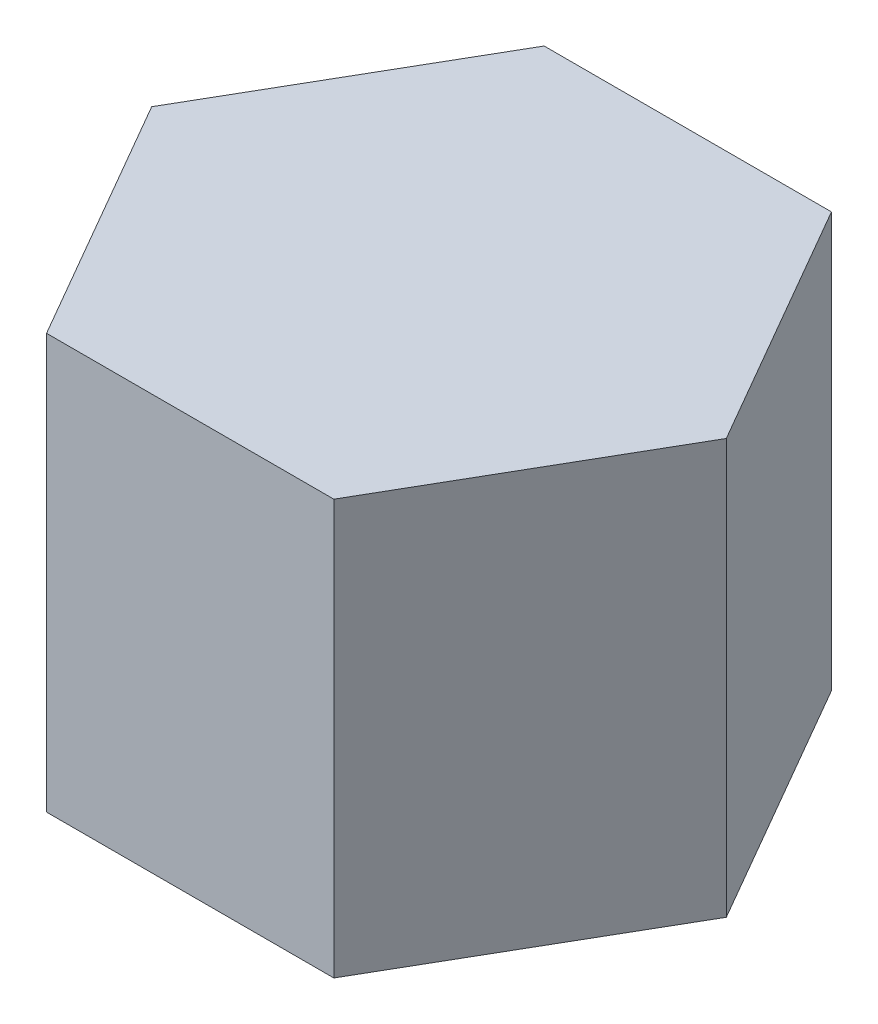
ISO-10303-21;
HEADER;
FILE_DESCRIPTION(('STEP AP214'),'2;1');
FILE_NAME('part.step','',(''),(''),'','','');
FILE_SCHEMA(('AUTOMOTIVE_DESIGN { 1 0 10303 214 1 1 1 1 }'));
ENDSEC;
DATA;
#1=APPLICATION_CONTEXT('core data for automotive mechanical design processes');
#2=APPLICATION_PROTOCOL_DEFINITION('international standard','automotive_design',2000,#1);
#3=PRODUCT_CONTEXT('',#1,'mechanical');
#4=PRODUCT('Part','Part','',(#3));
#5=PRODUCT_RELATED_PRODUCT_CATEGORY('part','',(#4));
#6=PRODUCT_DEFINITION_FORMATION('','',#4);
#7=PRODUCT_DEFINITION_CONTEXT('part definition',#1,'design');
#8=PRODUCT_DEFINITION('design','',#6,#7);
#9=PRODUCT_DEFINITION_SHAPE('','',#8);
#10=(LENGTH_UNIT() NAMED_UNIT(*) SI_UNIT(.MILLI.,.METRE.));
#11=(NAMED_UNIT(*) PLANE_ANGLE_UNIT() SI_UNIT($,.RADIAN.));
#12=(NAMED_UNIT(*) SI_UNIT($,.STERADIAN.) SOLID_ANGLE_UNIT());
#13=UNCERTAINTY_MEASURE_WITH_UNIT(LENGTH_MEASURE(1.E-05),#10,'distance_accuracy_value','');
#14=(GEOMETRIC_REPRESENTATION_CONTEXT(3) GLOBAL_UNCERTAINTY_ASSIGNED_CONTEXT((#13)) GLOBAL_UNIT_ASSIGNED_CONTEXT((#10,
#11,#12)) REPRESENTATION_CONTEXT('',''));
#15=CARTESIAN_POINT('',(0.,0.,0.));
#16=DIRECTION('',(0.,0.,1.));
#17=DIRECTION('',(1.,0.,0.));
#18=AXIS2_PLACEMENT_3D('',#15,#16,#17);
#19=CARTESIAN_POINT('',(32.3205080756887,25.,14.9999999999998));
#20=DIRECTION('',(-0.866025403784435,0.,0.500000000000007));
#21=DIRECTION('',(0.500000000000007,0.,0.866025403784435));
#22=AXIS2_PLACEMENT_3D('',#19,#20,#21);
#23=PLANE('',#22);
#24=DIRECTION('',(-0.500000000000007,0.,-0.866025403784435));
#25=VECTOR('',#24,1.);
#26=CARTESIAN_POINT('',(32.3205080756887,0.,14.9999999999998));
#27=LINE('',#26,#25);
#28=CARTESIAN_POINT('',(32.3205080756887,0.,14.9999999999998));
#29=VERTEX_POINT('',#28);
#30=CARTESIAN_POINT('',(23.6602540378443,0.,0.));
#31=VERTEX_POINT('',#30);
#32=EDGE_CURVE('E128',#29,#31,#27,.T.);
#33=ORIENTED_EDGE('',*,*,#32,.T.);
#34=DIRECTION('',(0.,-1.,0.));
#35=VECTOR('',#34,1.);
#36=CARTESIAN_POINT('',(23.6602540378443,25.,0.));
#37=LINE('',#36,#35);
#38=CARTESIAN_POINT('',(23.6602540378443,25.,0.));
#39=VERTEX_POINT('',#38);
#40=EDGE_CURVE('E11',#39,#31,#37,.T.);
#41=ORIENTED_EDGE('',*,*,#40,.F.);
#42=DIRECTION('',(-0.500000000000007,0.,-0.866025403784435));
#43=VECTOR('',#42,1.);
#44=CARTESIAN_POINT('',(32.3205080756887,25.,14.9999999999998));
#45=LINE('',#44,#43);
#46=CARTESIAN_POINT('',(32.3205080756887,25.,14.9999999999998));
#47=VERTEX_POINT('',#46);
#48=EDGE_CURVE('E144',#47,#39,#45,.T.);
#49=ORIENTED_EDGE('',*,*,#48,.F.);
#50=DIRECTION('',(0.,-1.,0.));
#51=VECTOR('',#50,1.);
#52=CARTESIAN_POINT('',(32.3205080756887,25.,14.9999999999998));
#53=LINE('',#52,#51);
#54=EDGE_CURVE('E124',#47,#29,#53,.T.);
#55=ORIENTED_EDGE('',*,*,#54,.T.);
#56=EDGE_LOOP('',(#33,#41,#49,#55));
#57=FACE_BOUND('',#56,.T.);
#58=ADVANCED_FACE('F39',(#57),#23,.F.);
#59=CARTESIAN_POINT('',(23.6602540378443,25.,0.));
#60=DIRECTION('',(0.,0.,1.));
#61=DIRECTION('',(1.,0.,0.));
#62=AXIS2_PLACEMENT_3D('',#59,#60,#61);
#63=PLANE('',#62);
#64=DIRECTION('',(-1.,0.,0.));
#65=VECTOR('',#64,1.);
#66=CARTESIAN_POINT('',(23.6602540378443,0.,0.));
#67=LINE('',#66,#65);
#68=CARTESIAN_POINT('',(6.33974596215555,0.,0.));
#69=VERTEX_POINT('',#68);
#70=EDGE_CURVE('E132',#31,#69,#67,.T.);
#71=ORIENTED_EDGE('',*,*,#70,.T.);
#72=DIRECTION('',(0.,-1.,0.));
#73=VECTOR('',#72,1.);
#74=CARTESIAN_POINT('',(6.33974596215555,25.,0.));
#75=LINE('',#74,#73);
#76=CARTESIAN_POINT('',(6.33974596215555,25.,0.));
#77=VERTEX_POINT('',#76);
#78=EDGE_CURVE('E48',#77,#69,#75,.T.);
#79=ORIENTED_EDGE('',*,*,#78,.F.);
#80=DIRECTION('',(-1.,0.,0.));
#81=VECTOR('',#80,1.);
#82=CARTESIAN_POINT('',(23.6602540378443,25.,0.));
#83=LINE('',#82,#81);
#84=EDGE_CURVE('E93',#39,#77,#83,.T.);
#85=ORIENTED_EDGE('',*,*,#84,.F.);
#86=ORIENTED_EDGE('',*,*,#40,.T.);
#87=EDGE_LOOP('',(#71,#79,#85,#86));
#88=FACE_BOUND('',#87,.T.);
#89=ADVANCED_FACE('F172',(#88),#63,.F.);
#90=CARTESIAN_POINT('',(6.33974596215555,25.,0.));
#91=DIRECTION('',(0.866025403784442,0.,0.499999999999995));
#92=DIRECTION('',(0.499999999999995,0.,-0.866025403784442));
#93=AXIS2_PLACEMENT_3D('',#90,#91,#92);
#94=PLANE('',#93);
#95=DIRECTION('',(-0.499999999999995,0.,0.866025403784441));
#96=VECTOR('',#95,1.);
#97=CARTESIAN_POINT('',(6.33974596215555,0.,0.));
#98=LINE('',#97,#96);
#99=CARTESIAN_POINT('',(-2.32050807568875,0.,15.0000000000001));
#100=VERTEX_POINT('',#99);
#101=EDGE_CURVE('E135',#69,#100,#98,.T.);
#102=ORIENTED_EDGE('',*,*,#101,.T.);
#103=DIRECTION('',(0.,-1.,0.));
#104=VECTOR('',#103,1.);
#105=CARTESIAN_POINT('',(-2.32050807568875,25.,15.0000000000001));
#106=LINE('',#105,#104);
#107=CARTESIAN_POINT('',(-2.32050807568875,25.,15.0000000000001));
#108=VERTEX_POINT('',#107);
#109=EDGE_CURVE('E117',#108,#100,#106,.T.);
#110=ORIENTED_EDGE('',*,*,#109,.F.);
#111=DIRECTION('',(-0.499999999999995,0.,0.866025403784441));
#112=VECTOR('',#111,1.);
#113=CARTESIAN_POINT('',(6.33974596215555,25.,0.));
#114=LINE('',#113,#112);
#115=EDGE_CURVE('E106',#77,#108,#114,.T.);
#116=ORIENTED_EDGE('',*,*,#115,.F.);
#117=ORIENTED_EDGE('',*,*,#78,.T.);
#118=EDGE_LOOP('',(#102,#110,#116,#117));
#119=FACE_BOUND('',#118,.T.);
#120=ADVANCED_FACE('F154',(#119),#94,.F.);
#121=CARTESIAN_POINT('',(-2.32050807568875,25.,15.0000000000001));
#122=DIRECTION('',(0.866025403784435,0.,-0.500000000000007));
#123=DIRECTION('',(-0.500000000000007,0.,-0.866025403784435));
#124=AXIS2_PLACEMENT_3D('',#121,#122,#123);
#125=PLANE('',#124);
#126=DIRECTION('',(0.500000000000007,0.,0.866025403784435));
#127=VECTOR('',#126,1.);
#128=CARTESIAN_POINT('',(-2.32050807568875,0.,15.0000000000001));
#129=LINE('',#128,#127);
#130=CARTESIAN_POINT('',(6.33974596215577,0.,30.0000000000001));
#131=VERTEX_POINT('',#130);
#132=EDGE_CURVE('E115',#100,#131,#129,.T.);
#133=ORIENTED_EDGE('',*,*,#132,.T.);
#134=DIRECTION('',(0.,-1.,0.));
#135=VECTOR('',#134,1.);
#136=CARTESIAN_POINT('',(6.33974596215577,25.,30.0000000000001));
#137=LINE('',#136,#135);
#138=CARTESIAN_POINT('',(6.33974596215577,25.,30.0000000000001));
#139=VERTEX_POINT('',#138);
#140=EDGE_CURVE('E112',#139,#131,#137,.T.);
#141=ORIENTED_EDGE('',*,*,#140,.F.);
#142=DIRECTION('',(0.500000000000007,0.,0.866025403784435));
#143=VECTOR('',#142,1.);
#144=CARTESIAN_POINT('',(-2.32050807568875,25.,15.0000000000001));
#145=LINE('',#144,#143);
#146=EDGE_CURVE('E100',#108,#139,#145,.T.);
#147=ORIENTED_EDGE('',*,*,#146,.F.);
#148=ORIENTED_EDGE('',*,*,#109,.T.);
#149=EDGE_LOOP('',(#133,#141,#147,#148));
#150=FACE_BOUND('',#149,.T.);
#151=ADVANCED_FACE('F113',(#150),#125,.F.);
#152=CARTESIAN_POINT('',(6.33974596215577,25.,30.0000000000001));
#153=DIRECTION('',(0.,0.,-1.));
#154=DIRECTION('',(-1.,0.,0.));
#155=AXIS2_PLACEMENT_3D('',#152,#153,#154);
#156=PLANE('',#155);
#157=DIRECTION('',(1.,0.,0.));
#158=VECTOR('',#157,1.);
#159=CARTESIAN_POINT('',(6.33974596215577,0.,30.0000000000001));
#160=LINE('',#159,#158);
#161=CARTESIAN_POINT('',(23.6602540378445,0.,29.9999999999999));
#162=VERTEX_POINT('',#161);
#163=EDGE_CURVE('E79',#131,#162,#160,.T.);
#164=ORIENTED_EDGE('',*,*,#163,.T.);
#165=DIRECTION('',(0.,-1.,0.));
#166=VECTOR('',#165,1.);
#167=CARTESIAN_POINT('',(23.6602540378445,25.,29.9999999999999));
#168=LINE('',#167,#166);
#169=CARTESIAN_POINT('',(23.6602540378445,25.,29.9999999999999));
#170=VERTEX_POINT('',#169);
#171=EDGE_CURVE('E118',#170,#162,#168,.T.);
#172=ORIENTED_EDGE('',*,*,#171,.F.);
#173=DIRECTION('',(1.,0.,0.));
#174=VECTOR('',#173,1.);
#175=CARTESIAN_POINT('',(6.33974596215577,25.,30.0000000000001));
#176=LINE('',#175,#174);
#177=EDGE_CURVE('E104',#139,#170,#176,.T.);
#178=ORIENTED_EDGE('',*,*,#177,.F.);
#179=ORIENTED_EDGE('',*,*,#140,.T.);
#180=EDGE_LOOP('',(#164,#172,#178,#179));
#181=FACE_BOUND('',#180,.T.);
#182=ADVANCED_FACE('F120',(#181),#156,.F.);
#183=CARTESIAN_POINT('',(23.6602540378445,25.,29.9999999999999));
#184=DIRECTION('',(-0.866025403784445,0.,-0.499999999999989));
#185=DIRECTION('',(-0.499999999999989,0.,0.866025403784445));
#186=AXIS2_PLACEMENT_3D('',#183,#184,#185);
#187=PLANE('',#186);
#188=DIRECTION('',(0.499999999999989,0.,-0.866025403784445));
#189=VECTOR('',#188,1.);
#190=CARTESIAN_POINT('',(23.6602540378445,0.,29.9999999999999));
#191=LINE('',#190,#189);
#192=EDGE_CURVE('E85',#162,#29,#191,.T.);
#193=ORIENTED_EDGE('',*,*,#192,.T.);
#194=ORIENTED_EDGE('',*,*,#54,.F.);
#195=DIRECTION('',(0.499999999999989,0.,-0.866025403784445));
#196=VECTOR('',#195,1.);
#197=CARTESIAN_POINT('',(23.6602540378445,25.,29.9999999999999));
#198=LINE('',#197,#196);
#199=EDGE_CURVE('E56',#170,#47,#198,.T.);
#200=ORIENTED_EDGE('',*,*,#199,.F.);
#201=ORIENTED_EDGE('',*,*,#171,.T.);
#202=EDGE_LOOP('',(#193,#194,#200,#201));
#203=FACE_BOUND('',#202,.T.);
#204=ADVANCED_FACE('F161',(#203),#187,.F.);
#205=CARTESIAN_POINT('',(0.,25.,0.));
#206=DIRECTION('',(0.,1.,0.));
#207=DIRECTION('',(0.,0.,1.));
#208=AXIS2_PLACEMENT_3D('',#205,#206,#207);
#209=PLANE('',#208);
#210=ORIENTED_EDGE('',*,*,#48,.T.);
#211=ORIENTED_EDGE('',*,*,#84,.T.);
#212=ORIENTED_EDGE('',*,*,#115,.T.);
#213=ORIENTED_EDGE('',*,*,#146,.T.);
#214=ORIENTED_EDGE('',*,*,#177,.T.);
#215=ORIENTED_EDGE('',*,*,#199,.T.);
#216=EDGE_LOOP('',(#210,#211,#212,#213,#214,#215));
#217=FACE_BOUND('',#216,.T.);
#218=ADVANCED_FACE('F102',(#217),#209,.T.);
#219=CARTESIAN_POINT('',(0.,0.,0.));
#220=DIRECTION('',(0.,1.,0.));
#221=DIRECTION('',(0.,0.,1.));
#222=AXIS2_PLACEMENT_3D('',#219,#220,#221);
#223=PLANE('',#222);
#224=ORIENTED_EDGE('',*,*,#32,.F.);
#225=ORIENTED_EDGE('',*,*,#192,.F.);
#226=ORIENTED_EDGE('',*,*,#163,.F.);
#227=ORIENTED_EDGE('',*,*,#132,.F.);
#228=ORIENTED_EDGE('',*,*,#101,.F.);
#229=ORIENTED_EDGE('',*,*,#70,.F.);
#230=EDGE_LOOP('',(#224,#225,#226,#227,#228,#229));
#231=FACE_BOUND('',#230,.T.);
#232=ADVANCED_FACE('F157',(#231),#223,.F.);
#233=CLOSED_SHELL('',(#58,#89,#120,#151,#182,#204,#218,#232));
#234=MANIFOLD_SOLID_BREP('B2',#233);
#235=ADVANCED_BREP_SHAPE_REPRESENTATION('',(#18,#234),#14);
#236=SHAPE_DEFINITION_REPRESENTATION(#9,#235);
ENDSEC;
END-ISO-10303-21;
